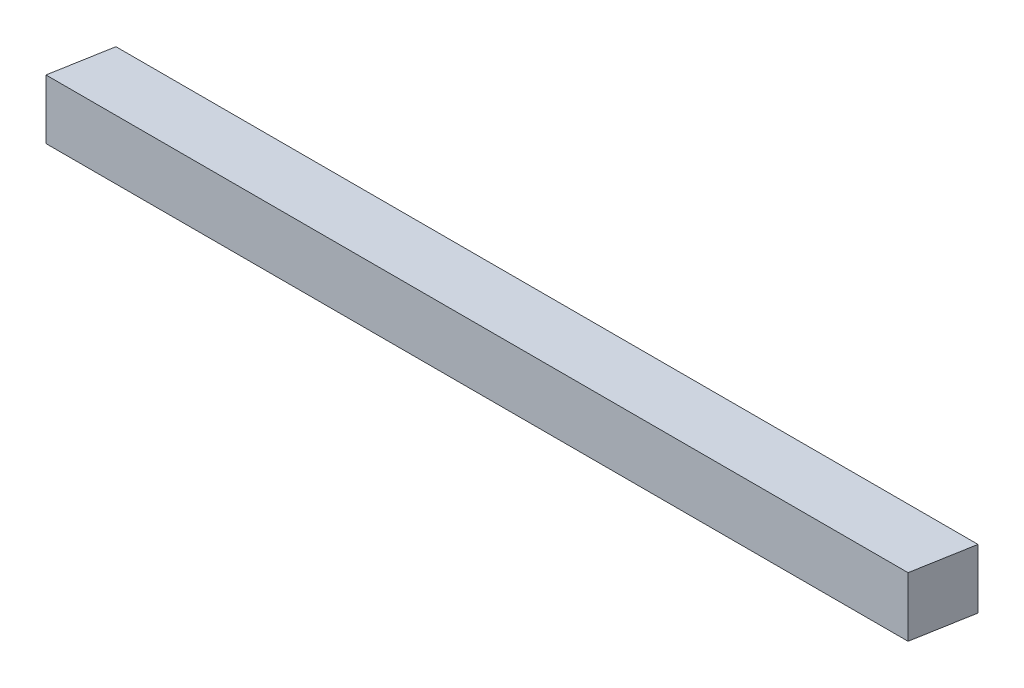
ISO-10303-21;
HEADER;
FILE_DESCRIPTION(('STEP AP214'),'2;1');
FILE_NAME('part.step','',(''),(''),'','','');
FILE_SCHEMA(('AUTOMOTIVE_DESIGN { 1 0 10303 214 1 1 1 1 }'));
ENDSEC;
DATA;
#1=APPLICATION_CONTEXT('core data for automotive mechanical design processes');
#2=APPLICATION_PROTOCOL_DEFINITION('international standard','automotive_design',2000,#1);
#3=PRODUCT_CONTEXT('',#1,'mechanical');
#4=PRODUCT('Part','Part','',(#3));
#5=PRODUCT_RELATED_PRODUCT_CATEGORY('part','',(#4));
#6=PRODUCT_DEFINITION_FORMATION('','',#4);
#7=PRODUCT_DEFINITION_CONTEXT('part definition',#1,'design');
#8=PRODUCT_DEFINITION('design','',#6,#7);
#9=PRODUCT_DEFINITION_SHAPE('','',#8);
#10=(LENGTH_UNIT() NAMED_UNIT(*) SI_UNIT(.MILLI.,.METRE.));
#11=(NAMED_UNIT(*) PLANE_ANGLE_UNIT() SI_UNIT($,.RADIAN.));
#12=(NAMED_UNIT(*) SI_UNIT($,.STERADIAN.) SOLID_ANGLE_UNIT());
#13=UNCERTAINTY_MEASURE_WITH_UNIT(LENGTH_MEASURE(1.E-05),#10,'distance_accuracy_value','');
#14=(GEOMETRIC_REPRESENTATION_CONTEXT(3) GLOBAL_UNCERTAINTY_ASSIGNED_CONTEXT((#13)) GLOBAL_UNIT_ASSIGNED_CONTEXT((#10,
#11,#12)) REPRESENTATION_CONTEXT('',''));
#15=CARTESIAN_POINT('',(0.,0.,0.));
#16=DIRECTION('',(0.,0.,1.));
#17=DIRECTION('',(1.,0.,0.));
#18=AXIS2_PLACEMENT_3D('',#15,#16,#17);
#19=CARTESIAN_POINT('',(184.15,12.7,0.));
#20=DIRECTION('',(0.,0.,-1.));
#21=DIRECTION('',(-1.,0.,0.));
#22=AXIS2_PLACEMENT_3D('',#19,#20,#21);
#23=PLANE('',#22);
#24=DIRECTION('',(1.,0.,0.));
#25=VECTOR('',#24,1.);
#26=CARTESIAN_POINT('',(184.15,0.,0.));
#27=LINE('',#26,#25);
#28=CARTESIAN_POINT('',(0.,0.,0.));
#29=VERTEX_POINT('',#28);
#30=CARTESIAN_POINT('',(184.15,0.,0.));
#31=VERTEX_POINT('',#30);
#32=EDGE_CURVE('E113',#29,#31,#27,.T.);
#33=ORIENTED_EDGE('',*,*,#32,.T.);
#34=DIRECTION('',(0.,-1.,0.));
#35=VECTOR('',#34,1.);
#36=CARTESIAN_POINT('',(184.15,12.7,0.));
#37=LINE('',#36,#35);
#38=CARTESIAN_POINT('',(184.15,12.7,0.));
#39=VERTEX_POINT('',#38);
#40=EDGE_CURVE('E11',#39,#31,#37,.T.);
#41=ORIENTED_EDGE('',*,*,#40,.F.);
#42=DIRECTION('',(1.,0.,0.));
#43=VECTOR('',#42,1.);
#44=CARTESIAN_POINT('',(184.15,12.7,0.));
#45=LINE('',#44,#43);
#46=CARTESIAN_POINT('',(0.,12.7,0.));
#47=VERTEX_POINT('',#46);
#48=EDGE_CURVE('E97',#47,#39,#45,.T.);
#49=ORIENTED_EDGE('',*,*,#48,.F.);
#50=DIRECTION('',(0.,-1.,0.));
#51=VECTOR('',#50,1.);
#52=CARTESIAN_POINT('',(0.,12.7,0.));
#53=LINE('',#52,#51);
#54=EDGE_CURVE('E109',#47,#29,#53,.T.);
#55=ORIENTED_EDGE('',*,*,#54,.T.);
#56=EDGE_LOOP('',(#33,#41,#49,#55));
#57=FACE_BOUND('',#56,.T.);
#58=ADVANCED_FACE('F45',(#57),#23,.F.);
#59=CARTESIAN_POINT('',(186.389352654998,12.7,-12.7));
#60=DIRECTION('',(-0.984807753012207,0.,-0.173648177666934));
#61=DIRECTION('',(-0.173648177666934,0.,0.984807753012207));
#62=AXIS2_PLACEMENT_3D('',#59,#60,#61);
#63=PLANE('',#62);
#64=DIRECTION('',(0.173648177666934,0.,-0.984807753012208));
#65=VECTOR('',#64,1.);
#66=CARTESIAN_POINT('',(186.389352654998,0.,-12.7));
#67=LINE('',#66,#65);
#68=CARTESIAN_POINT('',(186.389352654998,0.,-12.7));
#69=VERTEX_POINT('',#68);
#70=EDGE_CURVE('E102',#31,#69,#67,.T.);
#71=ORIENTED_EDGE('',*,*,#70,.T.);
#72=DIRECTION('',(0.,-1.,0.));
#73=VECTOR('',#72,1.);
#74=CARTESIAN_POINT('',(186.389352654998,12.7,-12.7));
#75=LINE('',#74,#73);
#76=CARTESIAN_POINT('',(186.389352654998,12.7,-12.7));
#77=VERTEX_POINT('',#76);
#78=EDGE_CURVE('E54',#77,#69,#75,.T.);
#79=ORIENTED_EDGE('',*,*,#78,.F.);
#80=DIRECTION('',(0.173648177666934,0.,-0.984807753012208));
#81=VECTOR('',#80,1.);
#82=CARTESIAN_POINT('',(186.389352654998,12.7,-12.7));
#83=LINE('',#82,#81);
#84=EDGE_CURVE('E92',#39,#77,#83,.T.);
#85=ORIENTED_EDGE('',*,*,#84,.F.);
#86=ORIENTED_EDGE('',*,*,#40,.T.);
#87=EDGE_LOOP('',(#71,#79,#85,#86));
#88=FACE_BOUND('',#87,.T.);
#89=ADVANCED_FACE('F101',(#88),#63,.F.);
#90=CARTESIAN_POINT('',(2.23935265499757,12.7,-12.7));
#91=DIRECTION('',(0.,0.,1.));
#92=DIRECTION('',(1.,0.,0.));
#93=AXIS2_PLACEMENT_3D('',#90,#91,#92);
#94=PLANE('',#93);
#95=DIRECTION('',(-1.,0.,0.));
#96=VECTOR('',#95,1.);
#97=CARTESIAN_POINT('',(2.23935265499757,0.,-12.7));
#98=LINE('',#97,#96);
#99=CARTESIAN_POINT('',(2.23935265499757,0.,-12.7));
#100=VERTEX_POINT('',#99);
#101=EDGE_CURVE('E79',#69,#100,#98,.T.);
#102=ORIENTED_EDGE('',*,*,#101,.T.);
#103=DIRECTION('',(0.,-1.,0.));
#104=VECTOR('',#103,1.);
#105=CARTESIAN_POINT('',(2.23935265499757,12.7,-12.7));
#106=LINE('',#105,#104);
#107=CARTESIAN_POINT('',(2.23935265499757,12.7,-12.7));
#108=VERTEX_POINT('',#107);
#109=EDGE_CURVE('E104',#108,#100,#106,.T.);
#110=ORIENTED_EDGE('',*,*,#109,.F.);
#111=DIRECTION('',(-1.,0.,0.));
#112=VECTOR('',#111,1.);
#113=CARTESIAN_POINT('',(2.23935265499757,12.7,-12.7));
#114=LINE('',#113,#112);
#115=EDGE_CURVE('E95',#77,#108,#114,.T.);
#116=ORIENTED_EDGE('',*,*,#115,.F.);
#117=ORIENTED_EDGE('',*,*,#78,.T.);
#118=EDGE_LOOP('',(#102,#110,#116,#117));
#119=FACE_BOUND('',#118,.T.);
#120=ADVANCED_FACE('F105',(#119),#94,.F.);
#121=CARTESIAN_POINT('',(0.,12.7,0.));
#122=DIRECTION('',(0.984807753012207,0.,0.173648177666935));
#123=DIRECTION('',(0.173648177666935,0.,-0.984807753012207));
#124=AXIS2_PLACEMENT_3D('',#121,#122,#123);
#125=PLANE('',#124);
#126=DIRECTION('',(-0.173648177666935,0.,0.984807753012207));
#127=VECTOR('',#126,1.);
#128=CARTESIAN_POINT('',(0.,0.,0.));
#129=LINE('',#128,#127);
#130=EDGE_CURVE('E85',#100,#29,#129,.T.);
#131=ORIENTED_EDGE('',*,*,#130,.T.);
#132=ORIENTED_EDGE('',*,*,#54,.F.);
#133=DIRECTION('',(-0.173648177666935,0.,0.984807753012207));
#134=VECTOR('',#133,1.);
#135=CARTESIAN_POINT('',(0.,12.7,0.));
#136=LINE('',#135,#134);
#137=EDGE_CURVE('E62',#108,#47,#136,.T.);
#138=ORIENTED_EDGE('',*,*,#137,.F.);
#139=ORIENTED_EDGE('',*,*,#109,.T.);
#140=EDGE_LOOP('',(#131,#132,#138,#139));
#141=FACE_BOUND('',#140,.T.);
#142=ADVANCED_FACE('F126',(#141),#125,.F.);
#143=CARTESIAN_POINT('',(0.,12.7,0.));
#144=DIRECTION('',(0.,-1.,0.));
#145=DIRECTION('',(0.,0.,-1.));
#146=AXIS2_PLACEMENT_3D('',#143,#144,#145);
#147=PLANE('',#146);
#148=ORIENTED_EDGE('',*,*,#48,.T.);
#149=ORIENTED_EDGE('',*,*,#84,.T.);
#150=ORIENTED_EDGE('',*,*,#115,.T.);
#151=ORIENTED_EDGE('',*,*,#137,.T.);
#152=EDGE_LOOP('',(#148,#149,#150,#151));
#153=FACE_BOUND('',#152,.T.);
#154=ADVANCED_FACE('F93',(#153),#147,.F.);
#155=CARTESIAN_POINT('',(0.,0.,0.));
#156=DIRECTION('',(0.,-1.,0.));
#157=DIRECTION('',(0.,0.,-1.));
#158=AXIS2_PLACEMENT_3D('',#155,#156,#157);
#159=PLANE('',#158);
#160=ORIENTED_EDGE('',*,*,#32,.F.);
#161=ORIENTED_EDGE('',*,*,#130,.F.);
#162=ORIENTED_EDGE('',*,*,#101,.F.);
#163=ORIENTED_EDGE('',*,*,#70,.F.);
#164=EDGE_LOOP('',(#160,#161,#162,#163));
#165=FACE_BOUND('',#164,.T.);
#166=ADVANCED_FACE('F129',(#165),#159,.T.);
#167=CLOSED_SHELL('',(#58,#89,#120,#142,#154,#166));
#168=MANIFOLD_SOLID_BREP('B2',#167);
#169=ADVANCED_BREP_SHAPE_REPRESENTATION('',(#18,#168),#14);
#170=SHAPE_DEFINITION_REPRESENTATION(#9,#169);
ENDSEC;
END-ISO-10303-21;
